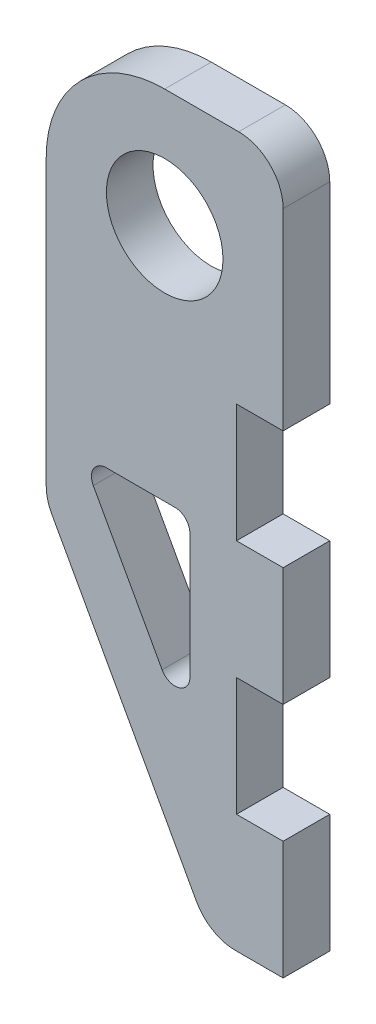
ISO-10303-21;
HEADER;
FILE_DESCRIPTION(('STEP AP214'),'2;1');
FILE_NAME('part.step','',(''),(''),'','','');
FILE_SCHEMA(('AUTOMOTIVE_DESIGN { 1 0 10303 214 1 1 1 1 }'));
ENDSEC;
DATA;
#1=APPLICATION_CONTEXT('core data for automotive mechanical design processes');
#2=APPLICATION_PROTOCOL_DEFINITION('international standard','automotive_design',2000,#1);
#3=PRODUCT_CONTEXT('',#1,'mechanical');
#4=PRODUCT('Part','Part','',(#3));
#5=PRODUCT_RELATED_PRODUCT_CATEGORY('part','',(#4));
#6=PRODUCT_DEFINITION_FORMATION('','',#4);
#7=PRODUCT_DEFINITION_CONTEXT('part definition',#1,'design');
#8=PRODUCT_DEFINITION('design','',#6,#7);
#9=PRODUCT_DEFINITION_SHAPE('','',#8);
#10=(LENGTH_UNIT() NAMED_UNIT(*) SI_UNIT(.MILLI.,.METRE.));
#11=(NAMED_UNIT(*) PLANE_ANGLE_UNIT() SI_UNIT($,.RADIAN.));
#12=(NAMED_UNIT(*) SI_UNIT($,.STERADIAN.) SOLID_ANGLE_UNIT());
#13=UNCERTAINTY_MEASURE_WITH_UNIT(LENGTH_MEASURE(1.E-05),#10,'distance_accuracy_value','');
#14=(GEOMETRIC_REPRESENTATION_CONTEXT(3) GLOBAL_UNCERTAINTY_ASSIGNED_CONTEXT((#13)) GLOBAL_UNIT_ASSIGNED_CONTEXT((#10,
#11,#12)) REPRESENTATION_CONTEXT('',''));
#15=CARTESIAN_POINT('',(0.,0.,0.));
#16=DIRECTION('',(0.,0.,1.));
#17=DIRECTION('',(1.,0.,0.));
#18=AXIS2_PLACEMENT_3D('',#15,#16,#17);
#19=CARTESIAN_POINT('',(0.,0.,4.));
#20=DIRECTION('',(0.,0.,-1.));
#21=DIRECTION('',(-1.,0.,0.));
#22=AXIS2_PLACEMENT_3D('',#19,#20,#21);
#23=PLANE('',#22);
#24=DIRECTION('',(0.,1.,0.));
#25=VECTOR('',#24,1.);
#26=CARTESIAN_POINT('',(2.16,-32.4804171709239,4.));
#27=LINE('',#26,#25);
#28=CARTESIAN_POINT('',(2.16,-32.4804171709239,4.));
#29=VERTEX_POINT('',#28);
#30=CARTESIAN_POINT('',(2.16,-21.749352535897,4.));
#31=VERTEX_POINT('',#30);
#32=EDGE_CURVE('E225',#29,#31,#27,.T.);
#33=ORIENTED_EDGE('',*,*,#32,.F.);
#34=CARTESIAN_POINT('',(0.890000000000003,-32.4804171709239,4.));
#35=DIRECTION('',(0.,0.,1.));
#36=DIRECTION('',(1.,0.,0.));
#37=AXIS2_PLACEMENT_3D('',#34,#35,#36);
#38=CIRCLE('',#37,1.27);
#39=CARTESIAN_POINT('',(-0.222794204019336,-33.0924539831345,4.));
#40=VERTEX_POINT('',#39);
#41=EDGE_CURVE('E60',#40,#29,#38,.T.);
#42=ORIENTED_EDGE('',*,*,#41,.F.);
#43=DIRECTION('',(0.481918749772156,-0.876215908676647,0.));
#44=VECTOR('',#43,1.);
#45=CARTESIAN_POINT('',(-6.12487975328415,-22.3613893481076,4.));
#46=LINE('',#45,#44);
#47=CARTESIAN_POINT('',(-6.12487975328415,-22.3613893481076,4.));
#48=VERTEX_POINT('',#47);
#49=EDGE_CURVE('E214',#48,#40,#46,.T.);
#50=ORIENTED_EDGE('',*,*,#49,.F.);
#51=CARTESIAN_POINT('',(-5.0120855492648,-21.749352535897,4.));
#52=DIRECTION('',(0.,0.,1.));
#53=DIRECTION('',(-1.,0.,0.));
#54=AXIS2_PLACEMENT_3D('',#51,#52,#53);
#55=CIRCLE('',#54,1.27);
#56=CARTESIAN_POINT('',(-5.0120855492648,-20.479352535897,4.));
#57=VERTEX_POINT('',#56);
#58=EDGE_CURVE('E241',#57,#48,#55,.T.);
#59=ORIENTED_EDGE('',*,*,#58,.F.);
#60=DIRECTION('',(-1.,0.,0.));
#61=VECTOR('',#60,1.);
#62=CARTESIAN_POINT('',(0.890000000000003,-20.479352535897,4.));
#63=LINE('',#62,#61);
#64=CARTESIAN_POINT('',(0.890000000000003,-20.479352535897,4.));
#65=VERTEX_POINT('',#64);
#66=EDGE_CURVE('E237',#65,#57,#63,.T.);
#67=ORIENTED_EDGE('',*,*,#66,.F.);
#68=CARTESIAN_POINT('',(0.890000000000003,-21.749352535897,4.));
#69=DIRECTION('',(0.,0.,1.));
#70=DIRECTION('',(1.,0.,0.));
#71=AXIS2_PLACEMENT_3D('',#68,#69,#70);
#72=CIRCLE('',#71,1.27);
#73=EDGE_CURVE('E233',#31,#65,#72,.T.);
#74=ORIENTED_EDGE('',*,*,#73,.F.);
#75=EDGE_LOOP('',(#33,#42,#50,#59,#67,#74));
#76=FACE_BOUND('',#75,.T.);
#77=CARTESIAN_POINT('',(0.,0.,4.));
#78=DIRECTION('',(0.,0.,1.));
#79=DIRECTION('',(-1.,0.,0.));
#80=AXIS2_PLACEMENT_3D('',#77,#78,#79);
#81=CIRCLE('',#80,10.16);
#82=CARTESIAN_POINT('',(0.,10.16,4.));
#83=VERTEX_POINT('',#82);
#84=CARTESIAN_POINT('',(-10.16,0.,4.));
#85=VERTEX_POINT('',#84);
#86=EDGE_CURVE('E269',#83,#85,#81,.T.);
#87=ORIENTED_EDGE('',*,*,#86,.T.);
#88=DIRECTION('',(0.,-1.,0.));
#89=VECTOR('',#88,1.);
#90=CARTESIAN_POINT('',(-10.16,0.,4.));
#91=LINE('',#90,#89);
#92=CARTESIAN_POINT('',(-10.16,-24.4213757232626,4.));
#93=VERTEX_POINT('',#92);
#94=EDGE_CURVE('E273',#85,#93,#91,.T.);
#95=ORIENTED_EDGE('',*,*,#94,.T.);
#96=CARTESIAN_POINT('',(-6.35,-24.4213757232626,4.));
#97=DIRECTION('',(0.,0.,1.));
#98=DIRECTION('',(-1.,0.,0.));
#99=AXIS2_PLACEMENT_3D('',#96,#97,#98);
#100=CIRCLE('',#99,3.81);
#101=CARTESIAN_POINT('',(-9.68838261205802,-26.2574861598945,4.));
#102=VERTEX_POINT('',#101);
#103=EDGE_CURVE('E277',#93,#102,#100,.T.);
#104=ORIENTED_EDGE('',*,*,#103,.T.);
#105=DIRECTION('',(0.481918749772156,-0.876215908676647,0.));
#106=VECTOR('',#105,1.);
#107=CARTESIAN_POINT('',(2.72436074014756,-48.8261104366319,4.));
#108=LINE('',#107,#106);
#109=CARTESIAN_POINT('',(2.72436074014756,-48.8261104366319,4.));
#110=VERTEX_POINT('',#109);
#111=EDGE_CURVE('E280',#102,#110,#108,.T.);
#112=ORIENTED_EDGE('',*,*,#111,.T.);
#113=CARTESIAN_POINT('',(6.06274335220559,-46.99,4.));
#114=DIRECTION('',(0.,0.,1.));
#115=DIRECTION('',(-1.,0.,0.));
#116=AXIS2_PLACEMENT_3D('',#113,#114,#115);
#117=CIRCLE('',#116,3.81);
#118=CARTESIAN_POINT('',(6.06274335220559,-50.8,4.));
#119=VERTEX_POINT('',#118);
#120=EDGE_CURVE('E283',#110,#119,#117,.T.);
#121=ORIENTED_EDGE('',*,*,#120,.T.);
#122=DIRECTION('',(1.,0.,0.));
#123=VECTOR('',#122,1.);
#124=CARTESIAN_POINT('',(10.16,-50.8,4.));
#125=LINE('',#124,#123);
#126=CARTESIAN_POINT('',(10.16,-50.8,4.));
#127=VERTEX_POINT('',#126);
#128=EDGE_CURVE('E286',#119,#127,#125,.T.);
#129=ORIENTED_EDGE('',*,*,#128,.T.);
#130=DIRECTION('',(0.,1.,0.));
#131=VECTOR('',#130,1.);
#132=CARTESIAN_POINT('',(10.16,-40.64,4.));
#133=LINE('',#132,#131);
#134=CARTESIAN_POINT('',(10.16,-40.64,4.));
#135=VERTEX_POINT('',#134);
#136=EDGE_CURVE('E289',#127,#135,#133,.T.);
#137=ORIENTED_EDGE('',*,*,#136,.T.);
#138=DIRECTION('',(-1.,0.,0.));
#139=VECTOR('',#138,1.);
#140=CARTESIAN_POINT('',(6.16000000000001,-40.64,4.));
#141=LINE('',#140,#139);
#142=CARTESIAN_POINT('',(6.16000000000001,-40.64,4.));
#143=VERTEX_POINT('',#142);
#144=EDGE_CURVE('E292',#135,#143,#141,.T.);
#145=ORIENTED_EDGE('',*,*,#144,.T.);
#146=DIRECTION('',(0.,1.,0.));
#147=VECTOR('',#146,1.);
#148=CARTESIAN_POINT('',(6.16,-30.48,4.));
#149=LINE('',#148,#147);
#150=CARTESIAN_POINT('',(6.16,-30.48,4.));
#151=VERTEX_POINT('',#150);
#152=EDGE_CURVE('E295',#143,#151,#149,.T.);
#153=ORIENTED_EDGE('',*,*,#152,.T.);
#154=DIRECTION('',(1.,0.,0.));
#155=VECTOR('',#154,1.);
#156=CARTESIAN_POINT('',(10.16,-30.48,4.));
#157=LINE('',#156,#155);
#158=CARTESIAN_POINT('',(10.16,-30.48,4.));
#159=VERTEX_POINT('',#158);
#160=EDGE_CURVE('E298',#151,#159,#157,.T.);
#161=ORIENTED_EDGE('',*,*,#160,.T.);
#162=DIRECTION('',(0.,1.,0.));
#163=VECTOR('',#162,1.);
#164=CARTESIAN_POINT('',(10.16,-20.32,4.));
#165=LINE('',#164,#163);
#166=CARTESIAN_POINT('',(10.16,-20.32,4.));
#167=VERTEX_POINT('',#166);
#168=EDGE_CURVE('E301',#159,#167,#165,.T.);
#169=ORIENTED_EDGE('',*,*,#168,.T.);
#170=DIRECTION('',(-1.,0.,0.));
#171=VECTOR('',#170,1.);
#172=CARTESIAN_POINT('',(6.16,-20.32,4.));
#173=LINE('',#172,#171);
#174=CARTESIAN_POINT('',(6.16,-20.32,4.));
#175=VERTEX_POINT('',#174);
#176=EDGE_CURVE('E304',#167,#175,#173,.T.);
#177=ORIENTED_EDGE('',*,*,#176,.T.);
#178=DIRECTION('',(0.,1.,0.));
#179=VECTOR('',#178,1.);
#180=CARTESIAN_POINT('',(6.16,-10.16,4.));
#181=LINE('',#180,#179);
#182=CARTESIAN_POINT('',(6.16,-10.16,4.));
#183=VERTEX_POINT('',#182);
#184=EDGE_CURVE('E307',#175,#183,#181,.T.);
#185=ORIENTED_EDGE('',*,*,#184,.T.);
#186=DIRECTION('',(1.,0.,0.));
#187=VECTOR('',#186,1.);
#188=CARTESIAN_POINT('',(10.16,-10.16,4.));
#189=LINE('',#188,#187);
#190=CARTESIAN_POINT('',(10.16,-10.16,4.));
#191=VERTEX_POINT('',#190);
#192=EDGE_CURVE('E310',#183,#191,#189,.T.);
#193=ORIENTED_EDGE('',*,*,#192,.T.);
#194=DIRECTION('',(0.,1.,0.));
#195=VECTOR('',#194,1.);
#196=CARTESIAN_POINT('',(10.16,6.34999999999998,4.));
#197=LINE('',#196,#195);
#198=CARTESIAN_POINT('',(10.16,6.34999999999998,4.));
#199=VERTEX_POINT('',#198);
#200=EDGE_CURVE('E313',#191,#199,#197,.T.);
#201=ORIENTED_EDGE('',*,*,#200,.T.);
#202=CARTESIAN_POINT('',(6.35,6.35,4.));
#203=DIRECTION('',(0.,0.,1.));
#204=DIRECTION('',(-1.,0.,0.));
#205=AXIS2_PLACEMENT_3D('',#202,#203,#204);
#206=CIRCLE('',#205,3.81);
#207=CARTESIAN_POINT('',(6.34999999999997,10.16,4.));
#208=VERTEX_POINT('',#207);
#209=EDGE_CURVE('E316',#199,#208,#206,.T.);
#210=ORIENTED_EDGE('',*,*,#209,.T.);
#211=DIRECTION('',(-1.,0.,0.));
#212=VECTOR('',#211,1.);
#213=CARTESIAN_POINT('',(0.,10.16,4.));
#214=LINE('',#213,#212);
#215=EDGE_CURVE('E319',#208,#83,#214,.T.);
#216=ORIENTED_EDGE('',*,*,#215,.T.);
#217=EDGE_LOOP('',(#87,#95,#104,#112,#121,#129,#137,#145,#153,#161,#169,#177,#185,#193,#201,
#210,#216));
#218=FACE_BOUND('',#217,.T.);
#219=CARTESIAN_POINT('',(0.,0.,4.));
#220=DIRECTION('',(0.,0.,1.));
#221=DIRECTION('',(1.,0.,0.));
#222=AXIS2_PLACEMENT_3D('',#219,#220,#221);
#223=CIRCLE('',#222,5.);
#224=CARTESIAN_POINT('',(5.,0.,4.));
#225=VERTEX_POINT('',#224);
#226=EDGE_CURVE('E261',#225,#225,#223,.T.);
#227=ORIENTED_EDGE('',*,*,#226,.F.);
#228=EDGE_LOOP('',(#227));
#229=FACE_BOUND('',#228,.T.);
#230=ADVANCED_FACE('F44',(#76,#218,#229),#23,.F.);
#231=CARTESIAN_POINT('',(0.,0.,0.));
#232=DIRECTION('',(0.,0.,-1.));
#233=DIRECTION('',(-1.,0.,0.));
#234=AXIS2_PLACEMENT_3D('',#231,#232,#233);
#235=PLANE('',#234);
#236=CARTESIAN_POINT('',(0.890000000000003,-32.4804171709239,0.));
#237=DIRECTION('',(0.,0.,-1.));
#238=DIRECTION('',(-1.,0.,0.));
#239=AXIS2_PLACEMENT_3D('',#236,#237,#238);
#240=CIRCLE('',#239,1.27);
#241=CARTESIAN_POINT('',(-0.222794204019335,-33.0924539831345,0.));
#242=VERTEX_POINT('',#241);
#243=CARTESIAN_POINT('',(2.16,-32.4804171709239,0.));
#244=VERTEX_POINT('',#243);
#245=EDGE_CURVE('E211',#242,#244,#240,.F.);
#246=ORIENTED_EDGE('',*,*,#245,.T.);
#247=DIRECTION('',(0.,1.,0.));
#248=VECTOR('',#247,1.);
#249=CARTESIAN_POINT('',(2.16,-32.4804171709239,0.));
#250=LINE('',#249,#248);
#251=CARTESIAN_POINT('',(2.16,-21.749352535897,0.));
#252=VERTEX_POINT('',#251);
#253=EDGE_CURVE('E199',#244,#252,#250,.T.);
#254=ORIENTED_EDGE('',*,*,#253,.T.);
#255=CARTESIAN_POINT('',(0.890000000000003,-21.749352535897,0.));
#256=DIRECTION('',(0.,0.,-1.));
#257=DIRECTION('',(-1.,0.,0.));
#258=AXIS2_PLACEMENT_3D('',#255,#256,#257);
#259=CIRCLE('',#258,1.27);
#260=CARTESIAN_POINT('',(0.890000000000003,-20.479352535897,0.));
#261=VERTEX_POINT('',#260);
#262=EDGE_CURVE('E674',#252,#261,#259,.F.);
#263=ORIENTED_EDGE('',*,*,#262,.T.);
#264=DIRECTION('',(-1.,0.,0.));
#265=VECTOR('',#264,1.);
#266=CARTESIAN_POINT('',(0.890000000000003,-20.479352535897,0.));
#267=LINE('',#266,#265);
#268=CARTESIAN_POINT('',(-5.0120855492648,-20.479352535897,0.));
#269=VERTEX_POINT('',#268);
#270=EDGE_CURVE('E679',#261,#269,#267,.T.);
#271=ORIENTED_EDGE('',*,*,#270,.T.);
#272=CARTESIAN_POINT('',(-5.0120855492648,-21.749352535897,0.));
#273=DIRECTION('',(0.,0.,-1.));
#274=DIRECTION('',(-1.,0.,0.));
#275=AXIS2_PLACEMENT_3D('',#272,#273,#274);
#276=CIRCLE('',#275,1.27);
#277=CARTESIAN_POINT('',(-6.12487975328415,-22.3613893481076,0.));
#278=VERTEX_POINT('',#277);
#279=EDGE_CURVE('E227',#269,#278,#276,.F.);
#280=ORIENTED_EDGE('',*,*,#279,.T.);
#281=DIRECTION('',(0.481918749772156,-0.876215908676647,0.));
#282=VECTOR('',#281,1.);
#283=CARTESIAN_POINT('',(-6.12487975328415,-22.3613893481076,0.));
#284=LINE('',#283,#282);
#285=EDGE_CURVE('E220',#278,#242,#284,.T.);
#286=ORIENTED_EDGE('',*,*,#285,.T.);
#287=EDGE_LOOP('',(#246,#254,#263,#271,#280,#286));
#288=FACE_BOUND('',#287,.T.);
#289=CARTESIAN_POINT('',(0.,0.,0.));
#290=DIRECTION('',(0.,0.,1.));
#291=DIRECTION('',(-1.,0.,0.));
#292=AXIS2_PLACEMENT_3D('',#289,#290,#291);
#293=CIRCLE('',#292,10.16);
#294=CARTESIAN_POINT('',(0.,10.16,0.));
#295=VERTEX_POINT('',#294);
#296=CARTESIAN_POINT('',(-10.16,0.,0.));
#297=VERTEX_POINT('',#296);
#298=EDGE_CURVE('E265',#295,#297,#293,.T.);
#299=ORIENTED_EDGE('',*,*,#298,.F.);
#300=DIRECTION('',(-1.,0.,0.));
#301=VECTOR('',#300,1.);
#302=CARTESIAN_POINT('',(0.,10.16,0.));
#303=LINE('',#302,#301);
#304=CARTESIAN_POINT('',(6.34999999999997,10.16,0.));
#305=VERTEX_POINT('',#304);
#306=EDGE_CURVE('E274',#305,#295,#303,.T.);
#307=ORIENTED_EDGE('',*,*,#306,.F.);
#308=CARTESIAN_POINT('',(6.35,6.35,0.));
#309=DIRECTION('',(0.,0.,1.));
#310=DIRECTION('',(-1.,0.,0.));
#311=AXIS2_PLACEMENT_3D('',#308,#309,#310);
#312=CIRCLE('',#311,3.81);
#313=CARTESIAN_POINT('',(10.16,6.34999999999998,0.));
#314=VERTEX_POINT('',#313);
#315=EDGE_CURVE('E368',#314,#305,#312,.T.);
#316=ORIENTED_EDGE('',*,*,#315,.F.);
#317=DIRECTION('',(0.,1.,0.));
#318=VECTOR('',#317,1.);
#319=CARTESIAN_POINT('',(10.16,6.34999999999998,0.));
#320=LINE('',#319,#318);
#321=CARTESIAN_POINT('',(10.16,-10.16,0.));
#322=VERTEX_POINT('',#321);
#323=EDGE_CURVE('E365',#322,#314,#320,.T.);
#324=ORIENTED_EDGE('',*,*,#323,.F.);
#325=DIRECTION('',(1.,0.,0.));
#326=VECTOR('',#325,1.);
#327=CARTESIAN_POINT('',(10.16,-10.16,0.));
#328=LINE('',#327,#326);
#329=CARTESIAN_POINT('',(6.16,-10.16,0.));
#330=VERTEX_POINT('',#329);
#331=EDGE_CURVE('E362',#330,#322,#328,.T.);
#332=ORIENTED_EDGE('',*,*,#331,.F.);
#333=DIRECTION('',(0.,1.,0.));
#334=VECTOR('',#333,1.);
#335=CARTESIAN_POINT('',(6.16,-10.16,0.));
#336=LINE('',#335,#334);
#337=CARTESIAN_POINT('',(6.16,-20.32,0.));
#338=VERTEX_POINT('',#337);
#339=EDGE_CURVE('E359',#338,#330,#336,.T.);
#340=ORIENTED_EDGE('',*,*,#339,.F.);
#341=DIRECTION('',(-1.,0.,0.));
#342=VECTOR('',#341,1.);
#343=CARTESIAN_POINT('',(6.16,-20.32,0.));
#344=LINE('',#343,#342);
#345=CARTESIAN_POINT('',(10.16,-20.32,0.));
#346=VERTEX_POINT('',#345);
#347=EDGE_CURVE('E356',#346,#338,#344,.T.);
#348=ORIENTED_EDGE('',*,*,#347,.F.);
#349=DIRECTION('',(0.,1.,0.));
#350=VECTOR('',#349,1.);
#351=CARTESIAN_POINT('',(10.16,-20.32,0.));
#352=LINE('',#351,#350);
#353=CARTESIAN_POINT('',(10.16,-30.48,0.));
#354=VERTEX_POINT('',#353);
#355=EDGE_CURVE('E353',#354,#346,#352,.T.);
#356=ORIENTED_EDGE('',*,*,#355,.F.);
#357=DIRECTION('',(1.,0.,0.));
#358=VECTOR('',#357,1.);
#359=CARTESIAN_POINT('',(10.16,-30.48,0.));
#360=LINE('',#359,#358);
#361=CARTESIAN_POINT('',(6.16,-30.48,0.));
#362=VERTEX_POINT('',#361);
#363=EDGE_CURVE('E350',#362,#354,#360,.T.);
#364=ORIENTED_EDGE('',*,*,#363,.F.);
#365=DIRECTION('',(0.,1.,0.));
#366=VECTOR('',#365,1.);
#367=CARTESIAN_POINT('',(6.16,-30.48,0.));
#368=LINE('',#367,#366);
#369=CARTESIAN_POINT('',(6.16000000000001,-40.64,0.));
#370=VERTEX_POINT('',#369);
#371=EDGE_CURVE('E347',#370,#362,#368,.T.);
#372=ORIENTED_EDGE('',*,*,#371,.F.);
#373=DIRECTION('',(-1.,0.,0.));
#374=VECTOR('',#373,1.);
#375=CARTESIAN_POINT('',(6.16000000000001,-40.64,0.));
#376=LINE('',#375,#374);
#377=CARTESIAN_POINT('',(10.16,-40.64,0.));
#378=VERTEX_POINT('',#377);
#379=EDGE_CURVE('E344',#378,#370,#376,.T.);
#380=ORIENTED_EDGE('',*,*,#379,.F.);
#381=DIRECTION('',(0.,1.,0.));
#382=VECTOR('',#381,1.);
#383=CARTESIAN_POINT('',(10.16,-40.64,0.));
#384=LINE('',#383,#382);
#385=CARTESIAN_POINT('',(10.16,-50.8,0.));
#386=VERTEX_POINT('',#385);
#387=EDGE_CURVE('E341',#386,#378,#384,.T.);
#388=ORIENTED_EDGE('',*,*,#387,.F.);
#389=DIRECTION('',(1.,0.,0.));
#390=VECTOR('',#389,1.);
#391=CARTESIAN_POINT('',(10.16,-50.8,0.));
#392=LINE('',#391,#390);
#393=CARTESIAN_POINT('',(6.06274335220559,-50.8,0.));
#394=VERTEX_POINT('',#393);
#395=EDGE_CURVE('E338',#394,#386,#392,.T.);
#396=ORIENTED_EDGE('',*,*,#395,.F.);
#397=CARTESIAN_POINT('',(6.06274335220559,-46.99,0.));
#398=DIRECTION('',(0.,0.,1.));
#399=DIRECTION('',(-1.,0.,0.));
#400=AXIS2_PLACEMENT_3D('',#397,#398,#399);
#401=CIRCLE('',#400,3.81);
#402=CARTESIAN_POINT('',(2.72436074014756,-48.8261104366319,0.));
#403=VERTEX_POINT('',#402);
#404=EDGE_CURVE('E335',#403,#394,#401,.T.);
#405=ORIENTED_EDGE('',*,*,#404,.F.);
#406=DIRECTION('',(0.481918749772156,-0.876215908676647,0.));
#407=VECTOR('',#406,1.);
#408=CARTESIAN_POINT('',(2.72436074014756,-48.8261104366319,0.));
#409=LINE('',#408,#407);
#410=CARTESIAN_POINT('',(-9.68838261205802,-26.2574861598945,0.));
#411=VERTEX_POINT('',#410);
#412=EDGE_CURVE('E332',#411,#403,#409,.T.);
#413=ORIENTED_EDGE('',*,*,#412,.F.);
#414=CARTESIAN_POINT('',(-6.35,-24.4213757232626,0.));
#415=DIRECTION('',(0.,0.,1.));
#416=DIRECTION('',(-1.,0.,0.));
#417=AXIS2_PLACEMENT_3D('',#414,#415,#416);
#418=CIRCLE('',#417,3.81);
#419=CARTESIAN_POINT('',(-10.16,-24.4213757232626,0.));
#420=VERTEX_POINT('',#419);
#421=EDGE_CURVE('E329',#420,#411,#418,.T.);
#422=ORIENTED_EDGE('',*,*,#421,.F.);
#423=DIRECTION('',(0.,-1.,0.));
#424=VECTOR('',#423,1.);
#425=CARTESIAN_POINT('',(-10.16,0.,0.));
#426=LINE('',#425,#424);
#427=EDGE_CURVE('E326',#297,#420,#426,.T.);
#428=ORIENTED_EDGE('',*,*,#427,.F.);
#429=EDGE_LOOP('',(#299,#307,#316,#324,#332,#340,#348,#356,#364,#372,#380,#388,#396,#405,#413,
#422,#428));
#430=FACE_BOUND('',#429,.T.);
#431=CARTESIAN_POINT('',(0.,0.,0.));
#432=DIRECTION('',(0.,0.,1.));
#433=DIRECTION('',(1.,0.,0.));
#434=AXIS2_PLACEMENT_3D('',#431,#432,#433);
#435=CIRCLE('',#434,5.);
#436=CARTESIAN_POINT('',(5.,0.,0.));
#437=VERTEX_POINT('',#436);
#438=EDGE_CURVE('E207',#437,#437,#435,.T.);
#439=ORIENTED_EDGE('',*,*,#438,.T.);
#440=EDGE_LOOP('',(#439));
#441=FACE_BOUND('',#440,.T.);
#442=ADVANCED_FACE('F217',(#288,#430,#441),#235,.T.);
#443=CARTESIAN_POINT('',(0.,0.,4.));
#444=DIRECTION('',(0.,0.,-1.));
#445=DIRECTION('',(-1.,0.,0.));
#446=AXIS2_PLACEMENT_3D('',#443,#444,#445);
#447=CYLINDRICAL_SURFACE('',#446,10.16);
#448=ORIENTED_EDGE('',*,*,#298,.T.);
#449=DIRECTION('',(0.,0.,-1.));
#450=VECTOR('',#449,1.);
#451=CARTESIAN_POINT('',(-10.16,0.,4.));
#452=LINE('',#451,#450);
#453=EDGE_CURVE('E11',#85,#297,#452,.T.);
#454=ORIENTED_EDGE('',*,*,#453,.F.);
#455=ORIENTED_EDGE('',*,*,#86,.F.);
#456=DIRECTION('',(0.,0.,-1.));
#457=VECTOR('',#456,1.);
#458=CARTESIAN_POINT('',(0.,10.16,4.));
#459=LINE('',#458,#457);
#460=EDGE_CURVE('E322',#83,#295,#459,.T.);
#461=ORIENTED_EDGE('',*,*,#460,.T.);
#462=EDGE_LOOP('',(#448,#454,#455,#461));
#463=FACE_BOUND('',#462,.T.);
#464=ADVANCED_FACE('F46',(#463),#447,.T.);
#465=CARTESIAN_POINT('',(-10.16,0.,4.));
#466=DIRECTION('',(1.,0.,0.));
#467=DIRECTION('',(0.,1.,0.));
#468=AXIS2_PLACEMENT_3D('',#465,#466,#467);
#469=PLANE('',#468);
#470=ORIENTED_EDGE('',*,*,#427,.T.);
#471=DIRECTION('',(0.,0.,-1.));
#472=VECTOR('',#471,1.);
#473=CARTESIAN_POINT('',(-10.16,-24.4213757232626,4.));
#474=LINE('',#473,#472);
#475=EDGE_CURVE('E53',#93,#420,#474,.T.);
#476=ORIENTED_EDGE('',*,*,#475,.F.);
#477=ORIENTED_EDGE('',*,*,#94,.F.);
#478=ORIENTED_EDGE('',*,*,#453,.T.);
#479=EDGE_LOOP('',(#470,#476,#477,#478));
#480=FACE_BOUND('',#479,.T.);
#481=ADVANCED_FACE('F459',(#480),#469,.F.);
#482=CARTESIAN_POINT('',(-6.35,-24.4213757232626,4.));
#483=DIRECTION('',(0.,0.,-1.));
#484=DIRECTION('',(-1.,0.,0.));
#485=AXIS2_PLACEMENT_3D('',#482,#483,#484);
#486=CYLINDRICAL_SURFACE('',#485,3.81);
#487=ORIENTED_EDGE('',*,*,#421,.T.);
#488=DIRECTION('',(0.,0.,-1.));
#489=VECTOR('',#488,1.);
#490=CARTESIAN_POINT('',(-9.68838261205802,-26.2574861598945,4.));
#491=LINE('',#490,#489);
#492=EDGE_CURVE('E428',#102,#411,#491,.T.);
#493=ORIENTED_EDGE('',*,*,#492,.F.);
#494=ORIENTED_EDGE('',*,*,#103,.F.);
#495=ORIENTED_EDGE('',*,*,#475,.T.);
#496=EDGE_LOOP('',(#487,#493,#494,#495));
#497=FACE_BOUND('',#496,.T.);
#498=ADVANCED_FACE('F437',(#497),#486,.T.);
#499=CARTESIAN_POINT('',(2.72436074014756,-48.8261104366319,4.));
#500=DIRECTION('',(0.876215908676647,0.481918749772156,0.));
#501=DIRECTION('',(-0.481918749772156,0.876215908676647,0.));
#502=AXIS2_PLACEMENT_3D('',#499,#500,#501);
#503=PLANE('',#502);
#504=ORIENTED_EDGE('',*,*,#412,.T.);
#505=DIRECTION('',(0.,0.,-1.));
#506=VECTOR('',#505,1.);
#507=CARTESIAN_POINT('',(2.72436074014756,-48.8261104366319,4.));
#508=LINE('',#507,#506);
#509=EDGE_CURVE('E424',#110,#403,#508,.T.);
#510=ORIENTED_EDGE('',*,*,#509,.F.);
#511=ORIENTED_EDGE('',*,*,#111,.F.);
#512=ORIENTED_EDGE('',*,*,#492,.T.);
#513=EDGE_LOOP('',(#504,#510,#511,#512));
#514=FACE_BOUND('',#513,.T.);
#515=ADVANCED_FACE('F447',(#514),#503,.F.);
#516=CARTESIAN_POINT('',(6.06274335220559,-46.99,4.));
#517=DIRECTION('',(0.,0.,-1.));
#518=DIRECTION('',(-1.,0.,0.));
#519=AXIS2_PLACEMENT_3D('',#516,#517,#518);
#520=CYLINDRICAL_SURFACE('',#519,3.81);
#521=ORIENTED_EDGE('',*,*,#404,.T.);
#522=DIRECTION('',(0.,0.,-1.));
#523=VECTOR('',#522,1.);
#524=CARTESIAN_POINT('',(6.06274335220559,-50.8,4.));
#525=LINE('',#524,#523);
#526=EDGE_CURVE('E420',#119,#394,#525,.T.);
#527=ORIENTED_EDGE('',*,*,#526,.F.);
#528=ORIENTED_EDGE('',*,*,#120,.F.);
#529=ORIENTED_EDGE('',*,*,#509,.T.);
#530=EDGE_LOOP('',(#521,#527,#528,#529));
#531=FACE_BOUND('',#530,.T.);
#532=ADVANCED_FACE('F451',(#531),#520,.T.);
#533=CARTESIAN_POINT('',(10.16,-50.8,4.));
#534=DIRECTION('',(0.,1.,0.));
#535=DIRECTION('',(0.,0.,1.));
#536=AXIS2_PLACEMENT_3D('',#533,#534,#535);
#537=PLANE('',#536);
#538=ORIENTED_EDGE('',*,*,#395,.T.);
#539=DIRECTION('',(0.,0.,-1.));
#540=VECTOR('',#539,1.);
#541=CARTESIAN_POINT('',(10.16,-50.8,4.));
#542=LINE('',#541,#540);
#543=EDGE_CURVE('E416',#127,#386,#542,.T.);
#544=ORIENTED_EDGE('',*,*,#543,.F.);
#545=ORIENTED_EDGE('',*,*,#128,.F.);
#546=ORIENTED_EDGE('',*,*,#526,.T.);
#547=EDGE_LOOP('',(#538,#544,#545,#546));
#548=FACE_BOUND('',#547,.T.);
#549=ADVANCED_FACE('F517',(#548),#537,.F.);
#550=CARTESIAN_POINT('',(10.16,-40.64,4.));
#551=DIRECTION('',(-1.,0.,0.));
#552=DIRECTION('',(0.,-1.,0.));
#553=AXIS2_PLACEMENT_3D('',#550,#551,#552);
#554=PLANE('',#553);
#555=ORIENTED_EDGE('',*,*,#387,.T.);
#556=DIRECTION('',(0.,0.,-1.));
#557=VECTOR('',#556,1.);
#558=CARTESIAN_POINT('',(10.16,-40.64,4.));
#559=LINE('',#558,#557);
#560=EDGE_CURVE('E412',#135,#378,#559,.T.);
#561=ORIENTED_EDGE('',*,*,#560,.F.);
#562=ORIENTED_EDGE('',*,*,#136,.F.);
#563=ORIENTED_EDGE('',*,*,#543,.T.);
#564=EDGE_LOOP('',(#555,#561,#562,#563));
#565=FACE_BOUND('',#564,.T.);
#566=ADVANCED_FACE('F515',(#565),#554,.F.);
#567=CARTESIAN_POINT('',(6.16000000000001,-40.64,4.));
#568=DIRECTION('',(0.,-1.,0.));
#569=DIRECTION('',(0.,0.,-1.));
#570=AXIS2_PLACEMENT_3D('',#567,#568,#569);
#571=PLANE('',#570);
#572=ORIENTED_EDGE('',*,*,#379,.T.);
#573=DIRECTION('',(0.,0.,-1.));
#574=VECTOR('',#573,1.);
#575=CARTESIAN_POINT('',(6.16000000000001,-40.64,4.));
#576=LINE('',#575,#574);
#577=EDGE_CURVE('E408',#143,#370,#576,.T.);
#578=ORIENTED_EDGE('',*,*,#577,.F.);
#579=ORIENTED_EDGE('',*,*,#144,.F.);
#580=ORIENTED_EDGE('',*,*,#560,.T.);
#581=EDGE_LOOP('',(#572,#578,#579,#580));
#582=FACE_BOUND('',#581,.T.);
#583=ADVANCED_FACE('F510',(#582),#571,.F.);
#584=CARTESIAN_POINT('',(6.16,-30.48,4.));
#585=DIRECTION('',(-1.,0.,0.));
#586=DIRECTION('',(0.,-1.,0.));
#587=AXIS2_PLACEMENT_3D('',#584,#585,#586);
#588=PLANE('',#587);
#589=ORIENTED_EDGE('',*,*,#371,.T.);
#590=DIRECTION('',(0.,0.,-1.));
#591=VECTOR('',#590,1.);
#592=CARTESIAN_POINT('',(6.16,-30.48,4.));
#593=LINE('',#592,#591);
#594=EDGE_CURVE('E404',#151,#362,#593,.T.);
#595=ORIENTED_EDGE('',*,*,#594,.F.);
#596=ORIENTED_EDGE('',*,*,#152,.F.);
#597=ORIENTED_EDGE('',*,*,#577,.T.);
#598=EDGE_LOOP('',(#589,#595,#596,#597));
#599=FACE_BOUND('',#598,.T.);
#600=ADVANCED_FACE('F505',(#599),#588,.F.);
#601=CARTESIAN_POINT('',(10.16,-30.48,4.));
#602=DIRECTION('',(0.,1.,0.));
#603=DIRECTION('',(-1.,0.,0.));
#604=AXIS2_PLACEMENT_3D('',#601,#602,#603);
#605=PLANE('',#604);
#606=ORIENTED_EDGE('',*,*,#363,.T.);
#607=DIRECTION('',(0.,0.,-1.));
#608=VECTOR('',#607,1.);
#609=CARTESIAN_POINT('',(10.16,-30.48,4.));
#610=LINE('',#609,#608);
#611=EDGE_CURVE('E400',#159,#354,#610,.T.);
#612=ORIENTED_EDGE('',*,*,#611,.F.);
#613=ORIENTED_EDGE('',*,*,#160,.F.);
#614=ORIENTED_EDGE('',*,*,#594,.T.);
#615=EDGE_LOOP('',(#606,#612,#613,#614));
#616=FACE_BOUND('',#615,.T.);
#617=ADVANCED_FACE('F501',(#616),#605,.F.);
#618=CARTESIAN_POINT('',(10.16,-20.32,4.));
#619=DIRECTION('',(-1.,0.,0.));
#620=DIRECTION('',(0.,0.,1.));
#621=AXIS2_PLACEMENT_3D('',#618,#619,#620);
#622=PLANE('',#621);
#623=ORIENTED_EDGE('',*,*,#355,.T.);
#624=DIRECTION('',(0.,0.,-1.));
#625=VECTOR('',#624,1.);
#626=CARTESIAN_POINT('',(10.16,-20.32,4.));
#627=LINE('',#626,#625);
#628=EDGE_CURVE('E396',#167,#346,#627,.T.);
#629=ORIENTED_EDGE('',*,*,#628,.F.);
#630=ORIENTED_EDGE('',*,*,#168,.F.);
#631=ORIENTED_EDGE('',*,*,#611,.T.);
#632=EDGE_LOOP('',(#623,#629,#630,#631));
#633=FACE_BOUND('',#632,.T.);
#634=ADVANCED_FACE('F496',(#633),#622,.F.);
#635=CARTESIAN_POINT('',(6.16,-20.32,4.));
#636=DIRECTION('',(0.,-1.,0.));
#637=DIRECTION('',(0.,0.,-1.));
#638=AXIS2_PLACEMENT_3D('',#635,#636,#637);
#639=PLANE('',#638);
#640=ORIENTED_EDGE('',*,*,#347,.T.);
#641=DIRECTION('',(0.,0.,-1.));
#642=VECTOR('',#641,1.);
#643=CARTESIAN_POINT('',(6.16,-20.32,4.));
#644=LINE('',#643,#642);
#645=EDGE_CURVE('E392',#175,#338,#644,.T.);
#646=ORIENTED_EDGE('',*,*,#645,.F.);
#647=ORIENTED_EDGE('',*,*,#176,.F.);
#648=ORIENTED_EDGE('',*,*,#628,.T.);
#649=EDGE_LOOP('',(#640,#646,#647,#648));
#650=FACE_BOUND('',#649,.T.);
#651=ADVANCED_FACE('F490',(#650),#639,.F.);
#652=CARTESIAN_POINT('',(6.16,-10.16,4.));
#653=DIRECTION('',(-1.,0.,0.));
#654=DIRECTION('',(0.,0.,1.));
#655=AXIS2_PLACEMENT_3D('',#652,#653,#654);
#656=PLANE('',#655);
#657=ORIENTED_EDGE('',*,*,#339,.T.);
#658=DIRECTION('',(0.,0.,-1.));
#659=VECTOR('',#658,1.);
#660=CARTESIAN_POINT('',(6.16,-10.16,4.));
#661=LINE('',#660,#659);
#662=EDGE_CURVE('E388',#183,#330,#661,.T.);
#663=ORIENTED_EDGE('',*,*,#662,.F.);
#664=ORIENTED_EDGE('',*,*,#184,.F.);
#665=ORIENTED_EDGE('',*,*,#645,.T.);
#666=EDGE_LOOP('',(#657,#663,#664,#665));
#667=FACE_BOUND('',#666,.T.);
#668=ADVANCED_FACE('F486',(#667),#656,.F.);
#669=CARTESIAN_POINT('',(10.16,-10.16,4.));
#670=DIRECTION('',(0.,1.,0.));
#671=DIRECTION('',(0.,0.,1.));
#672=AXIS2_PLACEMENT_3D('',#669,#670,#671);
#673=PLANE('',#672);
#674=ORIENTED_EDGE('',*,*,#331,.T.);
#675=DIRECTION('',(0.,0.,-1.));
#676=VECTOR('',#675,1.);
#677=CARTESIAN_POINT('',(10.16,-10.16,4.));
#678=LINE('',#677,#676);
#679=EDGE_CURVE('E384',#191,#322,#678,.T.);
#680=ORIENTED_EDGE('',*,*,#679,.F.);
#681=ORIENTED_EDGE('',*,*,#192,.F.);
#682=ORIENTED_EDGE('',*,*,#662,.T.);
#683=EDGE_LOOP('',(#674,#680,#681,#682));
#684=FACE_BOUND('',#683,.T.);
#685=ADVANCED_FACE('F481',(#684),#673,.F.);
#686=CARTESIAN_POINT('',(10.16,6.34999999999998,4.));
#687=DIRECTION('',(-1.,0.,0.));
#688=DIRECTION('',(0.,-1.,0.));
#689=AXIS2_PLACEMENT_3D('',#686,#687,#688);
#690=PLANE('',#689);
#691=ORIENTED_EDGE('',*,*,#323,.T.);
#692=DIRECTION('',(0.,0.,-1.));
#693=VECTOR('',#692,1.);
#694=CARTESIAN_POINT('',(10.16,6.34999999999998,4.));
#695=LINE('',#694,#693);
#696=EDGE_CURVE('E380',#199,#314,#695,.T.);
#697=ORIENTED_EDGE('',*,*,#696,.F.);
#698=ORIENTED_EDGE('',*,*,#200,.F.);
#699=ORIENTED_EDGE('',*,*,#679,.T.);
#700=EDGE_LOOP('',(#691,#697,#698,#699));
#701=FACE_BOUND('',#700,.T.);
#702=ADVANCED_FACE('F475',(#701),#690,.F.);
#703=CARTESIAN_POINT('',(6.35,6.35,4.));
#704=DIRECTION('',(0.,0.,-1.));
#705=DIRECTION('',(-1.,0.,0.));
#706=AXIS2_PLACEMENT_3D('',#703,#704,#705);
#707=CYLINDRICAL_SURFACE('',#706,3.81);
#708=ORIENTED_EDGE('',*,*,#315,.T.);
#709=DIRECTION('',(0.,0.,-1.));
#710=VECTOR('',#709,1.);
#711=CARTESIAN_POINT('',(6.34999999999997,10.16,4.));
#712=LINE('',#711,#710);
#713=EDGE_CURVE('E376',#208,#305,#712,.T.);
#714=ORIENTED_EDGE('',*,*,#713,.F.);
#715=ORIENTED_EDGE('',*,*,#209,.F.);
#716=ORIENTED_EDGE('',*,*,#696,.T.);
#717=EDGE_LOOP('',(#708,#714,#715,#716));
#718=FACE_BOUND('',#717,.T.);
#719=ADVANCED_FACE('F471',(#718),#707,.T.);
#720=CARTESIAN_POINT('',(0.,10.16,4.));
#721=DIRECTION('',(0.,-1.,0.));
#722=DIRECTION('',(0.,0.,-1.));
#723=AXIS2_PLACEMENT_3D('',#720,#721,#722);
#724=PLANE('',#723);
#725=ORIENTED_EDGE('',*,*,#306,.T.);
#726=ORIENTED_EDGE('',*,*,#460,.F.);
#727=ORIENTED_EDGE('',*,*,#215,.F.);
#728=ORIENTED_EDGE('',*,*,#713,.T.);
#729=EDGE_LOOP('',(#725,#726,#727,#728));
#730=FACE_BOUND('',#729,.T.);
#731=ADVANCED_FACE('F466',(#730),#724,.F.);
#732=CARTESIAN_POINT('',(0.,0.,4.));
#733=DIRECTION('',(0.,0.,-1.));
#734=DIRECTION('',(-1.,0.,0.));
#735=AXIS2_PLACEMENT_3D('',#732,#733,#734);
#736=CYLINDRICAL_SURFACE('',#735,5.);
#737=ORIENTED_EDGE('',*,*,#226,.T.);
#738=EDGE_LOOP('',(#737));
#739=FACE_BOUND('',#738,.T.);
#740=ORIENTED_EDGE('',*,*,#438,.F.);
#741=EDGE_LOOP('',(#740));
#742=FACE_BOUND('',#741,.T.);
#743=ADVANCED_FACE('F535',(#739,#742),#736,.F.);
#744=CARTESIAN_POINT('',(0.890000000000003,-32.4804171709239,-0.00100000000000013));
#745=DIRECTION('',(0.,0.,1.));
#746=DIRECTION('',(1.,0.,0.));
#747=AXIS2_PLACEMENT_3D('',#744,#745,#746);
#748=CYLINDRICAL_SURFACE('',#747,1.27);
#749=DIRECTION('',(0.,0.,1.));
#750=VECTOR('',#749,1.);
#751=CARTESIAN_POINT('',(-0.222794204019336,-33.0924539831345,-0.00100000000000013));
#752=LINE('',#751,#750);
#753=EDGE_CURVE('E208',#242,#40,#752,.T.);
#754=ORIENTED_EDGE('',*,*,#753,.T.);
#755=ORIENTED_EDGE('',*,*,#41,.T.);
#756=DIRECTION('',(0.,0.,1.));
#757=VECTOR('',#756,1.);
#758=CARTESIAN_POINT('',(2.16,-32.4804171709239,-0.00100000000000013));
#759=LINE('',#758,#757);
#760=EDGE_CURVE('E201',#244,#29,#759,.T.);
#761=ORIENTED_EDGE('',*,*,#760,.F.);
#762=ORIENTED_EDGE('',*,*,#245,.F.);
#763=EDGE_LOOP('',(#754,#755,#761,#762));
#764=FACE_BOUND('',#763,.T.);
#765=ADVANCED_FACE('F210',(#764),#748,.F.);
#766=CARTESIAN_POINT('',(-6.12487975328415,-22.3613893481076,-0.00100000000000013));
#767=DIRECTION('',(-0.876215908676647,-0.481918749772156,0.));
#768=DIRECTION('',(0.481918749772156,-0.876215908676647,0.));
#769=AXIS2_PLACEMENT_3D('',#766,#767,#768);
#770=PLANE('',#769);
#771=DIRECTION('',(0.,0.,1.));
#772=VECTOR('',#771,1.);
#773=CARTESIAN_POINT('',(-6.12487975328415,-22.3613893481076,-0.00100000000000013));
#774=LINE('',#773,#772);
#775=EDGE_CURVE('E250',#278,#48,#774,.T.);
#776=ORIENTED_EDGE('',*,*,#775,.T.);
#777=ORIENTED_EDGE('',*,*,#49,.T.);
#778=ORIENTED_EDGE('',*,*,#753,.F.);
#779=ORIENTED_EDGE('',*,*,#285,.F.);
#780=EDGE_LOOP('',(#776,#777,#778,#779));
#781=FACE_BOUND('',#780,.T.);
#782=ADVANCED_FACE('F622',(#781),#770,.F.);
#783=CARTESIAN_POINT('',(-5.0120855492648,-21.749352535897,-0.00100000000000013));
#784=DIRECTION('',(0.,0.,1.));
#785=DIRECTION('',(1.,0.,0.));
#786=AXIS2_PLACEMENT_3D('',#783,#784,#785);
#787=CYLINDRICAL_SURFACE('',#786,1.27);
#788=DIRECTION('',(0.,0.,1.));
#789=VECTOR('',#788,1.);
#790=CARTESIAN_POINT('',(-5.0120855492648,-20.479352535897,-0.00100000000000013));
#791=LINE('',#790,#789);
#792=EDGE_CURVE('E253',#269,#57,#791,.T.);
#793=ORIENTED_EDGE('',*,*,#792,.T.);
#794=ORIENTED_EDGE('',*,*,#58,.T.);
#795=ORIENTED_EDGE('',*,*,#775,.F.);
#796=ORIENTED_EDGE('',*,*,#279,.F.);
#797=EDGE_LOOP('',(#793,#794,#795,#796));
#798=FACE_BOUND('',#797,.T.);
#799=ADVANCED_FACE('F630',(#798),#787,.F.);
#800=CARTESIAN_POINT('',(0.890000000000003,-20.479352535897,-0.00100000000000013));
#801=DIRECTION('',(0.,1.,0.));
#802=DIRECTION('',(0.,0.,1.));
#803=AXIS2_PLACEMENT_3D('',#800,#801,#802);
#804=PLANE('',#803);
#805=DIRECTION('',(0.,0.,1.));
#806=VECTOR('',#805,1.);
#807=CARTESIAN_POINT('',(0.890000000000003,-20.479352535897,-0.00100000000000013));
#808=LINE('',#807,#806);
#809=EDGE_CURVE('E256',#261,#65,#808,.T.);
#810=ORIENTED_EDGE('',*,*,#809,.T.);
#811=ORIENTED_EDGE('',*,*,#66,.T.);
#812=ORIENTED_EDGE('',*,*,#792,.F.);
#813=ORIENTED_EDGE('',*,*,#270,.F.);
#814=EDGE_LOOP('',(#810,#811,#812,#813));
#815=FACE_BOUND('',#814,.T.);
#816=ADVANCED_FACE('F640',(#815),#804,.F.);
#817=CARTESIAN_POINT('',(0.890000000000003,-21.749352535897,-0.00100000000000013));
#818=DIRECTION('',(0.,0.,1.));
#819=DIRECTION('',(1.,0.,0.));
#820=AXIS2_PLACEMENT_3D('',#817,#818,#819);
#821=CYLINDRICAL_SURFACE('',#820,1.27);
#822=DIRECTION('',(0.,0.,1.));
#823=VECTOR('',#822,1.);
#824=CARTESIAN_POINT('',(2.16,-21.749352535897,-0.00100000000000013));
#825=LINE('',#824,#823);
#826=EDGE_CURVE('E68',#252,#31,#825,.T.);
#827=ORIENTED_EDGE('',*,*,#826,.T.);
#828=ORIENTED_EDGE('',*,*,#73,.T.);
#829=ORIENTED_EDGE('',*,*,#809,.F.);
#830=ORIENTED_EDGE('',*,*,#262,.F.);
#831=EDGE_LOOP('',(#827,#828,#829,#830));
#832=FACE_BOUND('',#831,.T.);
#833=ADVANCED_FACE('F650',(#832),#821,.F.);
#834=CARTESIAN_POINT('',(2.16,-32.4804171709239,-0.00100000000000013));
#835=DIRECTION('',(1.,0.,0.));
#836=DIRECTION('',(0.,1.,0.));
#837=AXIS2_PLACEMENT_3D('',#834,#835,#836);
#838=PLANE('',#837);
#839=ORIENTED_EDGE('',*,*,#760,.T.);
#840=ORIENTED_EDGE('',*,*,#32,.T.);
#841=ORIENTED_EDGE('',*,*,#826,.F.);
#842=ORIENTED_EDGE('',*,*,#253,.F.);
#843=EDGE_LOOP('',(#839,#840,#841,#842));
#844=FACE_BOUND('',#843,.T.);
#845=ADVANCED_FACE('F200',(#844),#838,.F.);
#846=CLOSED_SHELL('',(#230,#442,#464,#481,#498,#515,#532,#549,#566,#583,#600,#617,#634,#651,
#668,#685,#702,#719,#731,#743,#765,#782,#799,#816,#833,#845));
#847=MANIFOLD_SOLID_BREP('B2',#846);
#848=ADVANCED_BREP_SHAPE_REPRESENTATION('',(#18,#847),#14);
#849=SHAPE_DEFINITION_REPRESENTATION(#9,#848);
ENDSEC;
END-ISO-10303-21;
